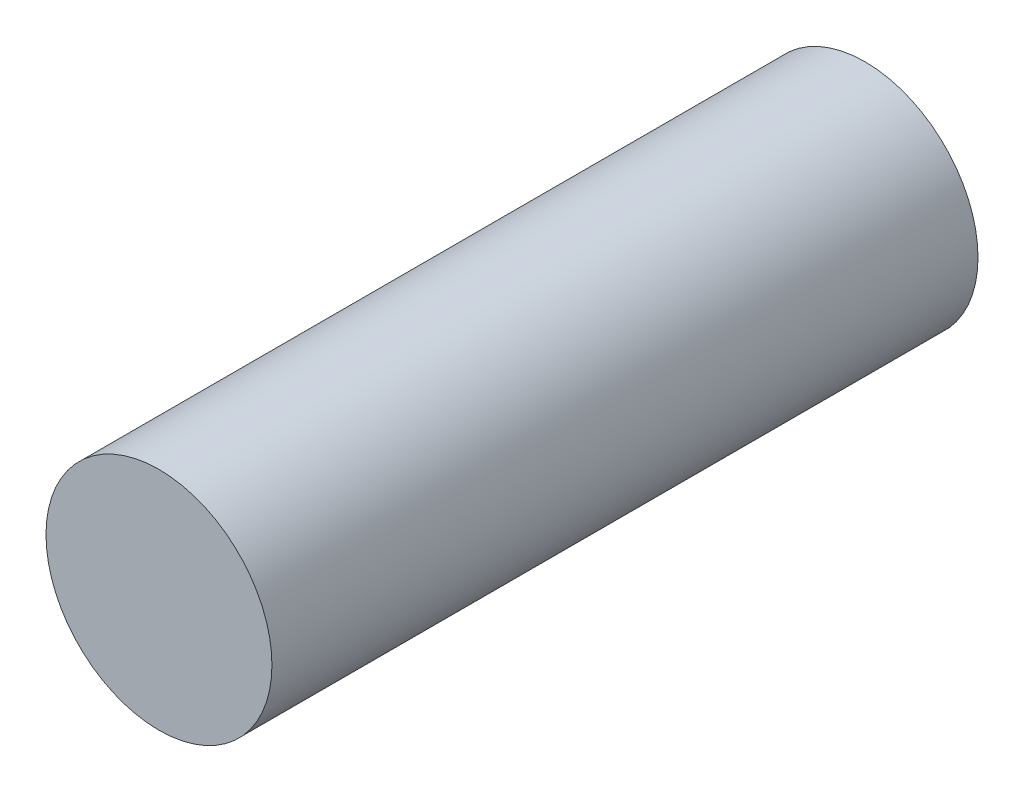
ISO-10303-21;
HEADER;
FILE_DESCRIPTION(('STEP AP214'),'2;1');
FILE_NAME('part.step','',(''),(''),'','','');
FILE_SCHEMA(('AUTOMOTIVE_DESIGN { 1 0 10303 214 1 1 1 1 }'));
ENDSEC;
DATA;
#1=APPLICATION_CONTEXT('core data for automotive mechanical design processes');
#2=APPLICATION_PROTOCOL_DEFINITION('international standard','automotive_design',2000,#1);
#3=PRODUCT_CONTEXT('',#1,'mechanical');
#4=PRODUCT('Part','Part','',(#3));
#5=PRODUCT_RELATED_PRODUCT_CATEGORY('part','',(#4));
#6=PRODUCT_DEFINITION_FORMATION('','',#4);
#7=PRODUCT_DEFINITION_CONTEXT('part definition',#1,'design');
#8=PRODUCT_DEFINITION('design','',#6,#7);
#9=PRODUCT_DEFINITION_SHAPE('','',#8);
#10=(LENGTH_UNIT() NAMED_UNIT(*) SI_UNIT(.MILLI.,.METRE.));
#11=(NAMED_UNIT(*) PLANE_ANGLE_UNIT() SI_UNIT($,.RADIAN.));
#12=(NAMED_UNIT(*) SI_UNIT($,.STERADIAN.) SOLID_ANGLE_UNIT());
#13=UNCERTAINTY_MEASURE_WITH_UNIT(LENGTH_MEASURE(1.E-05),#10,'distance_accuracy_value','');
#14=(GEOMETRIC_REPRESENTATION_CONTEXT(3) GLOBAL_UNCERTAINTY_ASSIGNED_CONTEXT((#13)) GLOBAL_UNIT_ASSIGNED_CONTEXT((#10,
#11,#12)) REPRESENTATION_CONTEXT('',''));
#15=CARTESIAN_POINT('',(0.,0.,0.));
#16=DIRECTION('',(0.,0.,1.));
#17=DIRECTION('',(1.,0.,0.));
#18=AXIS2_PLACEMENT_3D('',#15,#16,#17);
#19=CARTESIAN_POINT('',(0.,0.,25.));
#20=DIRECTION('',(0.,0.,-1.));
#21=DIRECTION('',(-1.,0.,0.));
#22=AXIS2_PLACEMENT_3D('',#19,#20,#21);
#23=CYLINDRICAL_SURFACE('',#22,4.);
#24=CARTESIAN_POINT('',(0.,0.,25.));
#25=DIRECTION('',(0.,0.,1.));
#26=DIRECTION('',(1.,0.,0.));
#27=AXIS2_PLACEMENT_3D('',#24,#25,#26);
#28=CIRCLE('',#27,4.);
#29=CARTESIAN_POINT('',(4.,0.,25.));
#30=VERTEX_POINT('',#29);
#31=EDGE_CURVE('E10',#30,#30,#28,.T.);
#32=ORIENTED_EDGE('',*,*,#31,.F.);
#33=EDGE_LOOP('',(#32));
#34=FACE_BOUND('',#33,.T.);
#35=CARTESIAN_POINT('',(0.,0.,0.));
#36=DIRECTION('',(0.,0.,1.));
#37=DIRECTION('',(1.,0.,0.));
#38=AXIS2_PLACEMENT_3D('',#35,#36,#37);
#39=CIRCLE('',#38,4.);
#40=CARTESIAN_POINT('',(4.,0.,0.));
#41=VERTEX_POINT('',#40);
#42=EDGE_CURVE('E38',#41,#41,#39,.T.);
#43=ORIENTED_EDGE('',*,*,#42,.T.);
#44=EDGE_LOOP('',(#43));
#45=FACE_BOUND('',#44,.T.);
#46=ADVANCED_FACE('F35',(#34,#45),#23,.T.);
#47=CARTESIAN_POINT('',(0.,0.,25.));
#48=DIRECTION('',(0.,0.,1.));
#49=DIRECTION('',(1.,0.,0.));
#50=AXIS2_PLACEMENT_3D('',#47,#48,#49);
#51=PLANE('',#50);
#52=ORIENTED_EDGE('',*,*,#31,.T.);
#53=EDGE_LOOP('',(#52));
#54=FACE_BOUND('',#53,.T.);
#55=ADVANCED_FACE('F50',(#54),#51,.T.);
#56=CARTESIAN_POINT('',(0.,0.,0.));
#57=DIRECTION('',(0.,0.,1.));
#58=DIRECTION('',(1.,0.,0.));
#59=AXIS2_PLACEMENT_3D('',#56,#57,#58);
#60=PLANE('',#59);
#61=ORIENTED_EDGE('',*,*,#42,.F.);
#62=EDGE_LOOP('',(#61));
#63=FACE_BOUND('',#62,.T.);
#64=ADVANCED_FACE('F48',(#63),#60,.F.);
#65=CLOSED_SHELL('',(#46,#55,#64));
#66=MANIFOLD_SOLID_BREP('B2',#65);
#67=ADVANCED_BREP_SHAPE_REPRESENTATION('',(#18,#66),#14);
#68=SHAPE_DEFINITION_REPRESENTATION(#9,#67);
ENDSEC;
END-ISO-10303-21;
